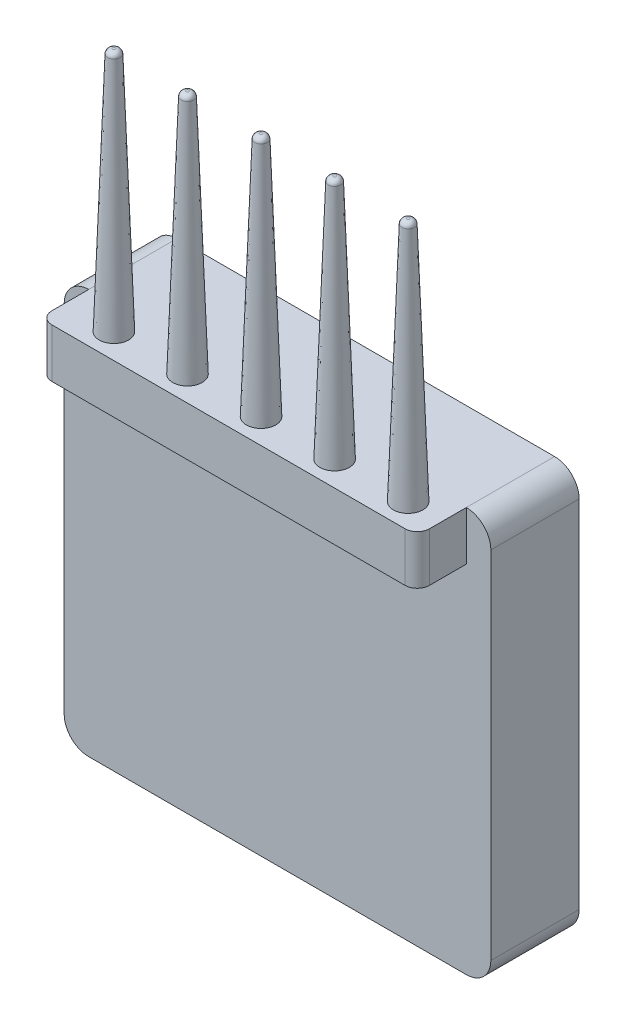
ISO-10303-21;
HEADER;
FILE_DESCRIPTION(('STEP AP214'),'2;1');
FILE_NAME('part.step','',(''),(''),'','','');
FILE_SCHEMA(('AUTOMOTIVE_DESIGN { 1 0 10303 214 1 1 1 1 }'));
ENDSEC;
DATA;
#1=APPLICATION_CONTEXT('core data for automotive mechanical design processes');
#2=APPLICATION_PROTOCOL_DEFINITION('international standard','automotive_design',2000,#1);
#3=PRODUCT_CONTEXT('',#1,'mechanical');
#4=PRODUCT('Part','Part','',(#3));
#5=PRODUCT_RELATED_PRODUCT_CATEGORY('part','',(#4));
#6=PRODUCT_DEFINITION_FORMATION('','',#4);
#7=PRODUCT_DEFINITION_CONTEXT('part definition',#1,'design');
#8=PRODUCT_DEFINITION('design','',#6,#7);
#9=PRODUCT_DEFINITION_SHAPE('','',#8);
#10=(LENGTH_UNIT() NAMED_UNIT(*) SI_UNIT(.MILLI.,.METRE.));
#11=(NAMED_UNIT(*) PLANE_ANGLE_UNIT() SI_UNIT($,.RADIAN.));
#12=(NAMED_UNIT(*) SI_UNIT($,.STERADIAN.) SOLID_ANGLE_UNIT());
#13=UNCERTAINTY_MEASURE_WITH_UNIT(LENGTH_MEASURE(1.E-05),#10,'distance_accuracy_value','');
#14=(GEOMETRIC_REPRESENTATION_CONTEXT(3) GLOBAL_UNCERTAINTY_ASSIGNED_CONTEXT((#13)) GLOBAL_UNIT_ASSIGNED_CONTEXT((#10,
#11,#12)) REPRESENTATION_CONTEXT('',''));
#15=CARTESIAN_POINT('',(0.,0.,0.));
#16=DIRECTION('',(0.,0.,1.));
#17=DIRECTION('',(1.,0.,0.));
#18=AXIS2_PLACEMENT_3D('',#15,#16,#17);
#19=CARTESIAN_POINT('',(-77.,-72.5,36.));
#20=DIRECTION('',(0.,0.,-1.));
#21=DIRECTION('',(-1.,0.,0.));
#22=AXIS2_PLACEMENT_3D('',#19,#20,#21);
#23=PLANE('',#22);
#24=DIRECTION('',(0.,-1.,0.));
#25=VECTOR('',#24,1.);
#26=CARTESIAN_POINT('',(-76.9999999999999,82.5,36.));
#27=LINE('',#26,#25);
#28=CARTESIAN_POINT('',(-76.9999999999999,82.5,36.));
#29=VERTEX_POINT('',#28);
#30=CARTESIAN_POINT('',(-76.9999999999999,62.5,36.));
#31=VERTEX_POINT('',#30);
#32=EDGE_CURVE('E154',#29,#31,#27,.T.);
#33=ORIENTED_EDGE('',*,*,#32,.F.);
#34=CARTESIAN_POINT('',(-77.,72.5,36.));
#35=DIRECTION('',(0.,0.,1.));
#36=DIRECTION('',(-1.,0.,0.));
#37=AXIS2_PLACEMENT_3D('',#34,#35,#36);
#38=CIRCLE('',#37,9.99999999999999);
#39=CARTESIAN_POINT('',(-87.,72.4999999999999,36.));
#40=VERTEX_POINT('',#39);
#41=EDGE_CURVE('E176',#29,#40,#38,.T.);
#42=ORIENTED_EDGE('',*,*,#41,.T.);
#43=DIRECTION('',(0.,-1.,0.));
#44=VECTOR('',#43,1.);
#45=CARTESIAN_POINT('',(-87.,-72.5,36.));
#46=LINE('',#45,#44);
#47=CARTESIAN_POINT('',(-87.,-72.5,36.));
#48=VERTEX_POINT('',#47);
#49=EDGE_CURVE('E178',#40,#48,#46,.T.);
#50=ORIENTED_EDGE('',*,*,#49,.T.);
#51=CARTESIAN_POINT('',(-77.,-72.5,36.));
#52=DIRECTION('',(0.,0.,1.));
#53=DIRECTION('',(-1.,0.,0.));
#54=AXIS2_PLACEMENT_3D('',#51,#52,#53);
#55=CIRCLE('',#54,9.99999999999999);
#56=CARTESIAN_POINT('',(-76.9999999999999,-82.5,36.));
#57=VERTEX_POINT('',#56);
#58=EDGE_CURVE('E165',#48,#57,#55,.T.);
#59=ORIENTED_EDGE('',*,*,#58,.T.);
#60=DIRECTION('',(1.,0.,0.));
#61=VECTOR('',#60,1.);
#62=CARTESIAN_POINT('',(-76.9999999999999,-82.5,36.));
#63=LINE('',#62,#61);
#64=CARTESIAN_POINT('',(76.9999999999999,-82.5,36.));
#65=VERTEX_POINT('',#64);
#66=EDGE_CURVE('E168',#57,#65,#63,.T.);
#67=ORIENTED_EDGE('',*,*,#66,.T.);
#68=CARTESIAN_POINT('',(77.,-72.5,36.));
#69=DIRECTION('',(0.,0.,1.));
#70=DIRECTION('',(1.,0.,0.));
#71=AXIS2_PLACEMENT_3D('',#68,#69,#70);
#72=CIRCLE('',#71,9.99999999999999);
#73=CARTESIAN_POINT('',(87.,-72.5,36.));
#74=VERTEX_POINT('',#73);
#75=EDGE_CURVE('E171',#65,#74,#72,.T.);
#76=ORIENTED_EDGE('',*,*,#75,.T.);
#77=DIRECTION('',(0.,1.,0.));
#78=VECTOR('',#77,1.);
#79=CARTESIAN_POINT('',(87.,-72.5,36.));
#80=LINE('',#79,#78);
#81=CARTESIAN_POINT('',(87.,72.4999999999999,36.));
#82=VERTEX_POINT('',#81);
#83=EDGE_CURVE('E173',#74,#82,#80,.T.);
#84=ORIENTED_EDGE('',*,*,#83,.T.);
#85=CARTESIAN_POINT('',(77.,72.5,36.));
#86=DIRECTION('',(0.,0.,1.));
#87=DIRECTION('',(-1.,0.,0.));
#88=AXIS2_PLACEMENT_3D('',#85,#86,#87);
#89=CIRCLE('',#88,9.99999999999999);
#90=CARTESIAN_POINT('',(76.9999999999999,82.5,36.));
#91=VERTEX_POINT('',#90);
#92=EDGE_CURVE('E148',#82,#91,#89,.T.);
#93=ORIENTED_EDGE('',*,*,#92,.T.);
#94=DIRECTION('',(0.,1.,0.));
#95=VECTOR('',#94,1.);
#96=CARTESIAN_POINT('',(76.9999999999999,82.5,36.));
#97=LINE('',#96,#95);
#98=CARTESIAN_POINT('',(76.9999999999999,62.5,36.));
#99=VERTEX_POINT('',#98);
#100=EDGE_CURVE('E133',#99,#91,#97,.T.);
#101=ORIENTED_EDGE('',*,*,#100,.F.);
#102=DIRECTION('',(1.,0.,0.));
#103=VECTOR('',#102,1.);
#104=CARTESIAN_POINT('',(-76.9999999999999,62.5,36.));
#105=LINE('',#104,#103);
#106=EDGE_CURVE('E145',#31,#99,#105,.T.);
#107=ORIENTED_EDGE('',*,*,#106,.F.);
#108=EDGE_LOOP('',(#33,#42,#50,#59,#67,#76,#84,#93,#101,#107));
#109=FACE_BOUND('',#108,.T.);
#110=ADVANCED_FACE('F35',(#109),#23,.F.);
#111=CARTESIAN_POINT('',(-77.,-72.5,36.));
#112=DIRECTION('',(0.,0.,-1.));
#113=DIRECTION('',(-1.,0.,0.));
#114=AXIS2_PLACEMENT_3D('',#111,#112,#113);
#115=CYLINDRICAL_SURFACE('',#114,9.99999999999999);
#116=CARTESIAN_POINT('',(-77.,-72.5,0.));
#117=DIRECTION('',(0.,0.,1.));
#118=DIRECTION('',(-1.,0.,0.));
#119=AXIS2_PLACEMENT_3D('',#116,#117,#118);
#120=CIRCLE('',#119,9.99999999999999);
#121=CARTESIAN_POINT('',(-87.,-72.5,0.));
#122=VERTEX_POINT('',#121);
#123=CARTESIAN_POINT('',(-76.9999999999999,-82.5,0.));
#124=VERTEX_POINT('',#123);
#125=EDGE_CURVE('E164',#122,#124,#120,.T.);
#126=ORIENTED_EDGE('',*,*,#125,.T.);
#127=DIRECTION('',(0.,0.,-1.));
#128=VECTOR('',#127,1.);
#129=CARTESIAN_POINT('',(-76.9999999999999,-82.5,36.));
#130=LINE('',#129,#128);
#131=EDGE_CURVE('E216',#57,#124,#130,.T.);
#132=ORIENTED_EDGE('',*,*,#131,.F.);
#133=ORIENTED_EDGE('',*,*,#58,.F.);
#134=DIRECTION('',(0.,0.,-1.));
#135=VECTOR('',#134,1.);
#136=CARTESIAN_POINT('',(-87.,-72.5,36.));
#137=LINE('',#136,#135);
#138=EDGE_CURVE('E180',#48,#122,#137,.T.);
#139=ORIENTED_EDGE('',*,*,#138,.T.);
#140=EDGE_LOOP('',(#126,#132,#133,#139));
#141=FACE_BOUND('',#140,.T.);
#142=ADVANCED_FACE('F302',(#141),#115,.T.);
#143=CARTESIAN_POINT('',(-76.9999999999999,-82.5,36.));
#144=DIRECTION('',(0.,1.,0.));
#145=DIRECTION('',(0.,0.,1.));
#146=AXIS2_PLACEMENT_3D('',#143,#144,#145);
#147=PLANE('',#146);
#148=DIRECTION('',(1.,0.,0.));
#149=VECTOR('',#148,1.);
#150=CARTESIAN_POINT('',(-76.9999999999999,-82.5,0.));
#151=LINE('',#150,#149);
#152=CARTESIAN_POINT('',(76.9999999999999,-82.5,0.));
#153=VERTEX_POINT('',#152);
#154=EDGE_CURVE('E183',#124,#153,#151,.T.);
#155=ORIENTED_EDGE('',*,*,#154,.T.);
#156=DIRECTION('',(0.,0.,-1.));
#157=VECTOR('',#156,1.);
#158=CARTESIAN_POINT('',(76.9999999999999,-82.5,36.));
#159=LINE('',#158,#157);
#160=EDGE_CURVE('E213',#65,#153,#159,.T.);
#161=ORIENTED_EDGE('',*,*,#160,.F.);
#162=ORIENTED_EDGE('',*,*,#66,.F.);
#163=ORIENTED_EDGE('',*,*,#131,.T.);
#164=EDGE_LOOP('',(#155,#161,#162,#163));
#165=FACE_BOUND('',#164,.T.);
#166=ADVANCED_FACE('F305',(#165),#147,.F.);
#167=CARTESIAN_POINT('',(77.,-72.5,36.));
#168=DIRECTION('',(0.,0.,-1.));
#169=DIRECTION('',(-1.,0.,0.));
#170=AXIS2_PLACEMENT_3D('',#167,#168,#169);
#171=CYLINDRICAL_SURFACE('',#170,9.99999999999999);
#172=CARTESIAN_POINT('',(77.,-72.5,0.));
#173=DIRECTION('',(0.,0.,1.));
#174=DIRECTION('',(1.,0.,0.));
#175=AXIS2_PLACEMENT_3D('',#172,#173,#174);
#176=CIRCLE('',#175,9.99999999999999);
#177=CARTESIAN_POINT('',(87.,-72.5,0.));
#178=VERTEX_POINT('',#177);
#179=EDGE_CURVE('E185',#153,#178,#176,.T.);
#180=ORIENTED_EDGE('',*,*,#179,.T.);
#181=DIRECTION('',(0.,0.,-1.));
#182=VECTOR('',#181,1.);
#183=CARTESIAN_POINT('',(87.,-72.5,36.));
#184=LINE('',#183,#182);
#185=EDGE_CURVE('E210',#74,#178,#184,.T.);
#186=ORIENTED_EDGE('',*,*,#185,.F.);
#187=ORIENTED_EDGE('',*,*,#75,.F.);
#188=ORIENTED_EDGE('',*,*,#160,.T.);
#189=EDGE_LOOP('',(#180,#186,#187,#188));
#190=FACE_BOUND('',#189,.T.);
#191=ADVANCED_FACE('F310',(#190),#171,.T.);
#192=CARTESIAN_POINT('',(87.,-72.5,36.));
#193=DIRECTION('',(-1.,0.,0.));
#194=DIRECTION('',(0.,0.,1.));
#195=AXIS2_PLACEMENT_3D('',#192,#193,#194);
#196=PLANE('',#195);
#197=DIRECTION('',(0.,1.,0.));
#198=VECTOR('',#197,1.);
#199=CARTESIAN_POINT('',(87.,-72.5,0.));
#200=LINE('',#199,#198);
#201=CARTESIAN_POINT('',(87.,72.4999999999999,0.));
#202=VERTEX_POINT('',#201);
#203=EDGE_CURVE('E187',#178,#202,#200,.T.);
#204=ORIENTED_EDGE('',*,*,#203,.T.);
#205=DIRECTION('',(0.,0.,-1.));
#206=VECTOR('',#205,1.);
#207=CARTESIAN_POINT('',(87.,72.4999999999999,36.));
#208=LINE('',#207,#206);
#209=EDGE_CURVE('E207',#82,#202,#208,.T.);
#210=ORIENTED_EDGE('',*,*,#209,.F.);
#211=ORIENTED_EDGE('',*,*,#83,.F.);
#212=ORIENTED_EDGE('',*,*,#185,.T.);
#213=EDGE_LOOP('',(#204,#210,#211,#212));
#214=FACE_BOUND('',#213,.T.);
#215=ADVANCED_FACE('F314',(#214),#196,.F.);
#216=CARTESIAN_POINT('',(77.,72.5,36.));
#217=DIRECTION('',(0.,0.,-1.));
#218=DIRECTION('',(-1.,0.,0.));
#219=AXIS2_PLACEMENT_3D('',#216,#217,#218);
#220=CYLINDRICAL_SURFACE('',#219,9.99999999999999);
#221=CARTESIAN_POINT('',(77.,72.5,0.));
#222=DIRECTION('',(0.,0.,1.));
#223=DIRECTION('',(-1.,0.,0.));
#224=AXIS2_PLACEMENT_3D('',#221,#222,#223);
#225=CIRCLE('',#224,9.99999999999999);
#226=CARTESIAN_POINT('',(76.9999999999999,82.5,0.));
#227=VERTEX_POINT('',#226);
#228=EDGE_CURVE('E189',#202,#227,#225,.T.);
#229=ORIENTED_EDGE('',*,*,#228,.T.);
#230=DIRECTION('',(0.,0.,-1.));
#231=VECTOR('',#230,1.);
#232=CARTESIAN_POINT('',(76.9999999999999,82.5,36.));
#233=LINE('',#232,#231);
#234=EDGE_CURVE('E204',#91,#227,#233,.T.);
#235=ORIENTED_EDGE('',*,*,#234,.F.);
#236=ORIENTED_EDGE('',*,*,#92,.F.);
#237=ORIENTED_EDGE('',*,*,#209,.T.);
#238=EDGE_LOOP('',(#229,#235,#236,#237));
#239=FACE_BOUND('',#238,.T.);
#240=ADVANCED_FACE('F318',(#239),#220,.T.);
#241=CARTESIAN_POINT('',(-76.9999999999999,82.5,36.));
#242=DIRECTION('',(0.,-1.,0.));
#243=DIRECTION('',(0.,0.,-1.));
#244=AXIS2_PLACEMENT_3D('',#241,#242,#243);
#245=PLANE('',#244);
#246=CARTESIAN_POINT('',(63.0000000000001,82.5,45.7165139862272));
#247=DIRECTION('',(0.,-1.,0.));
#248=DIRECTION('',(0.,0.,-1.));
#249=AXIS2_PLACEMENT_3D('',#246,#247,#248);
#250=CIRCLE('',#249,6.);
#251=CARTESIAN_POINT('',(63.0000000000001,82.5,39.7165139862272));
#252=VERTEX_POINT('',#251);
#253=EDGE_CURVE('E231',#252,#252,#250,.F.);
#254=ORIENTED_EDGE('',*,*,#253,.F.);
#255=EDGE_LOOP('',(#254));
#256=FACE_BOUND('',#255,.T.);
#257=CARTESIAN_POINT('',(33.0000000000001,82.5,45.7165139862272));
#258=DIRECTION('',(0.,-1.,0.));
#259=DIRECTION('',(0.,0.,-1.));
#260=AXIS2_PLACEMENT_3D('',#257,#258,#259);
#261=CIRCLE('',#260,6.00000000000001);
#262=CARTESIAN_POINT('',(33.0000000000001,82.5,39.7165139862272));
#263=VERTEX_POINT('',#262);
#264=EDGE_CURVE('E228',#263,#263,#261,.F.);
#265=ORIENTED_EDGE('',*,*,#264,.F.);
#266=EDGE_LOOP('',(#265));
#267=FACE_BOUND('',#266,.T.);
#268=CARTESIAN_POINT('',(3.00000000000007,82.5,45.7165139862272));
#269=DIRECTION('',(0.,-1.,0.));
#270=DIRECTION('',(0.,0.,-1.));
#271=AXIS2_PLACEMENT_3D('',#268,#269,#270);
#272=CIRCLE('',#271,6.);
#273=CARTESIAN_POINT('',(3.00000000000007,82.5,39.7165139862272));
#274=VERTEX_POINT('',#273);
#275=EDGE_CURVE('E225',#274,#274,#272,.F.);
#276=ORIENTED_EDGE('',*,*,#275,.F.);
#277=EDGE_LOOP('',(#276));
#278=FACE_BOUND('',#277,.T.);
#279=CARTESIAN_POINT('',(-26.9999999999999,82.5,45.7165139862272));
#280=DIRECTION('',(0.,-1.,0.));
#281=DIRECTION('',(0.,0.,-1.));
#282=AXIS2_PLACEMENT_3D('',#279,#280,#281);
#283=CIRCLE('',#282,6.);
#284=CARTESIAN_POINT('',(-26.9999999999999,82.5,39.7165139862272));
#285=VERTEX_POINT('',#284);
#286=EDGE_CURVE('E222',#285,#285,#283,.F.);
#287=ORIENTED_EDGE('',*,*,#286,.F.);
#288=EDGE_LOOP('',(#287));
#289=FACE_BOUND('',#288,.T.);
#290=CARTESIAN_POINT('',(-56.9999999999999,82.5,45.7165139862272));
#291=DIRECTION('',(0.,-1.,0.));
#292=DIRECTION('',(0.,0.,-1.));
#293=AXIS2_PLACEMENT_3D('',#290,#291,#292);
#294=CIRCLE('',#293,6.00000000000001);
#295=CARTESIAN_POINT('',(-56.9999999999999,82.5,39.7165139862272));
#296=VERTEX_POINT('',#295);
#297=EDGE_CURVE('E219',#296,#296,#294,.F.);
#298=ORIENTED_EDGE('',*,*,#297,.F.);
#299=EDGE_LOOP('',(#298));
#300=FACE_BOUND('',#299,.T.);
#301=DIRECTION('',(0.,0.,-1.));
#302=VECTOR('',#301,1.);
#303=CARTESIAN_POINT('',(-76.9999999999999,82.5,56.));
#304=LINE('',#303,#302);
#305=CARTESIAN_POINT('',(-76.9999999999999,82.5,51.));
#306=VERTEX_POINT('',#305);
#307=EDGE_CURVE('E159',#306,#29,#304,.T.);
#308=ORIENTED_EDGE('',*,*,#307,.F.);
#309=CARTESIAN_POINT('',(-71.9999999999999,82.5,51.));
#310=DIRECTION('',(0.,-1.,0.));
#311=DIRECTION('',(0.,0.,-1.));
#312=AXIS2_PLACEMENT_3D('',#309,#310,#311);
#313=CIRCLE('',#312,5.);
#314=CARTESIAN_POINT('',(-71.9999999999999,82.5,56.));
#315=VERTEX_POINT('',#314);
#316=EDGE_CURVE('E43',#306,#315,#313,.F.);
#317=ORIENTED_EDGE('',*,*,#316,.T.);
#318=DIRECTION('',(-1.,0.,0.));
#319=VECTOR('',#318,1.);
#320=CARTESIAN_POINT('',(-76.9999999999999,82.5,56.));
#321=LINE('',#320,#319);
#322=CARTESIAN_POINT('',(71.9999999999999,82.5,56.));
#323=VERTEX_POINT('',#322);
#324=EDGE_CURVE('E161',#323,#315,#321,.T.);
#325=ORIENTED_EDGE('',*,*,#324,.F.);
#326=CARTESIAN_POINT('',(71.9999999999999,82.5,51.));
#327=DIRECTION('',(0.,-1.,0.));
#328=DIRECTION('',(0.,0.,-1.));
#329=AXIS2_PLACEMENT_3D('',#326,#327,#328);
#330=CIRCLE('',#329,5.);
#331=CARTESIAN_POINT('',(76.9999999999999,82.5,51.));
#332=VERTEX_POINT('',#331);
#333=EDGE_CURVE('E50',#323,#332,#330,.F.);
#334=ORIENTED_EDGE('',*,*,#333,.T.);
#335=DIRECTION('',(0.,0.,-1.));
#336=VECTOR('',#335,1.);
#337=CARTESIAN_POINT('',(76.9999999999999,82.5,56.));
#338=LINE('',#337,#336);
#339=EDGE_CURVE('E139',#332,#91,#338,.T.);
#340=ORIENTED_EDGE('',*,*,#339,.T.);
#341=ORIENTED_EDGE('',*,*,#234,.T.);
#342=DIRECTION('',(-1.,0.,0.));
#343=VECTOR('',#342,1.);
#344=CARTESIAN_POINT('',(-76.9999999999999,82.5,0.));
#345=LINE('',#344,#343);
#346=CARTESIAN_POINT('',(-76.9999999999999,82.5,0.));
#347=VERTEX_POINT('',#346);
#348=EDGE_CURVE('E191',#227,#347,#345,.T.);
#349=ORIENTED_EDGE('',*,*,#348,.T.);
#350=DIRECTION('',(0.,0.,-1.));
#351=VECTOR('',#350,1.);
#352=CARTESIAN_POINT('',(-76.9999999999999,82.5,36.));
#353=LINE('',#352,#351);
#354=EDGE_CURVE('E201',#29,#347,#353,.T.);
#355=ORIENTED_EDGE('',*,*,#354,.F.);
#356=EDGE_LOOP('',(#308,#317,#325,#334,#340,#341,#349,#355));
#357=FACE_BOUND('',#356,.T.);
#358=ADVANCED_FACE('F277',(#256,#267,#278,#289,#300,#357),#245,.F.);
#359=CARTESIAN_POINT('',(-77.,72.5,36.));
#360=DIRECTION('',(0.,0.,-1.));
#361=DIRECTION('',(-1.,0.,0.));
#362=AXIS2_PLACEMENT_3D('',#359,#360,#361);
#363=CYLINDRICAL_SURFACE('',#362,9.99999999999999);
#364=CARTESIAN_POINT('',(-77.,72.5,0.));
#365=DIRECTION('',(0.,0.,1.));
#366=DIRECTION('',(-1.,0.,0.));
#367=AXIS2_PLACEMENT_3D('',#364,#365,#366);
#368=CIRCLE('',#367,9.99999999999999);
#369=CARTESIAN_POINT('',(-87.,72.4999999999999,0.));
#370=VERTEX_POINT('',#369);
#371=EDGE_CURVE('E193',#347,#370,#368,.T.);
#372=ORIENTED_EDGE('',*,*,#371,.T.);
#373=DIRECTION('',(0.,0.,-1.));
#374=VECTOR('',#373,1.);
#375=CARTESIAN_POINT('',(-87.,72.4999999999999,36.));
#376=LINE('',#375,#374);
#377=EDGE_CURVE('E198',#40,#370,#376,.T.);
#378=ORIENTED_EDGE('',*,*,#377,.F.);
#379=ORIENTED_EDGE('',*,*,#41,.F.);
#380=ORIENTED_EDGE('',*,*,#354,.T.);
#381=EDGE_LOOP('',(#372,#378,#379,#380));
#382=FACE_BOUND('',#381,.T.);
#383=ADVANCED_FACE('F292',(#382),#363,.T.);
#384=CARTESIAN_POINT('',(-87.,-72.5,36.));
#385=DIRECTION('',(1.,0.,0.));
#386=DIRECTION('',(0.,0.,-1.));
#387=AXIS2_PLACEMENT_3D('',#384,#385,#386);
#388=PLANE('',#387);
#389=DIRECTION('',(0.,-1.,0.));
#390=VECTOR('',#389,1.);
#391=CARTESIAN_POINT('',(-87.,-72.5,0.));
#392=LINE('',#391,#390);
#393=EDGE_CURVE('E169',#370,#122,#392,.T.);
#394=ORIENTED_EDGE('',*,*,#393,.T.);
#395=ORIENTED_EDGE('',*,*,#138,.F.);
#396=ORIENTED_EDGE('',*,*,#49,.F.);
#397=ORIENTED_EDGE('',*,*,#377,.T.);
#398=EDGE_LOOP('',(#394,#395,#396,#397));
#399=FACE_BOUND('',#398,.T.);
#400=ADVANCED_FACE('F297',(#399),#388,.F.);
#401=CARTESIAN_POINT('',(-77.,-72.5,0.));
#402=DIRECTION('',(0.,0.,-1.));
#403=DIRECTION('',(-1.,0.,0.));
#404=AXIS2_PLACEMENT_3D('',#401,#402,#403);
#405=PLANE('',#404);
#406=ORIENTED_EDGE('',*,*,#125,.F.);
#407=ORIENTED_EDGE('',*,*,#393,.F.);
#408=ORIENTED_EDGE('',*,*,#371,.F.);
#409=ORIENTED_EDGE('',*,*,#348,.F.);
#410=ORIENTED_EDGE('',*,*,#228,.F.);
#411=ORIENTED_EDGE('',*,*,#203,.F.);
#412=ORIENTED_EDGE('',*,*,#179,.F.);
#413=ORIENTED_EDGE('',*,*,#154,.F.);
#414=EDGE_LOOP('',(#406,#407,#408,#409,#410,#411,#412,#413));
#415=FACE_BOUND('',#414,.T.);
#416=ADVANCED_FACE('F320',(#415),#405,.T.);
#417=CARTESIAN_POINT('',(-76.9999999999999,82.5,56.));
#418=DIRECTION('',(1.,0.,0.));
#419=DIRECTION('',(0.,0.,-1.));
#420=AXIS2_PLACEMENT_3D('',#417,#418,#419);
#421=PLANE('',#420);
#422=DIRECTION('',(0.,0.,-1.));
#423=VECTOR('',#422,1.);
#424=CARTESIAN_POINT('',(-76.9999999999999,62.5,56.));
#425=LINE('',#424,#423);
#426=CARTESIAN_POINT('',(-76.9999999999999,62.5,51.));
#427=VERTEX_POINT('',#426);
#428=EDGE_CURVE('E138',#427,#31,#425,.T.);
#429=ORIENTED_EDGE('',*,*,#428,.F.);
#430=DIRECTION('',(0.,-1.,0.));
#431=VECTOR('',#430,1.);
#432=CARTESIAN_POINT('',(-76.9999999999999,82.5,51.));
#433=LINE('',#432,#431);
#434=EDGE_CURVE('E58',#427,#306,#433,.F.);
#435=ORIENTED_EDGE('',*,*,#434,.T.);
#436=ORIENTED_EDGE('',*,*,#307,.T.);
#437=ORIENTED_EDGE('',*,*,#32,.T.);
#438=EDGE_LOOP('',(#429,#435,#436,#437));
#439=FACE_BOUND('',#438,.T.);
#440=ADVANCED_FACE('F286',(#439),#421,.F.);
#441=CARTESIAN_POINT('',(-76.9999999999999,62.5,56.));
#442=DIRECTION('',(0.,1.,0.));
#443=DIRECTION('',(0.,0.,1.));
#444=AXIS2_PLACEMENT_3D('',#441,#442,#443);
#445=PLANE('',#444);
#446=DIRECTION('',(1.,0.,0.));
#447=VECTOR('',#446,1.);
#448=CARTESIAN_POINT('',(-76.9999999999999,62.5,56.));
#449=LINE('',#448,#447);
#450=CARTESIAN_POINT('',(-71.9999999999999,62.5,56.));
#451=VERTEX_POINT('',#450);
#452=CARTESIAN_POINT('',(71.9999999999999,62.5,56.));
#453=VERTEX_POINT('',#452);
#454=EDGE_CURVE('E150',#451,#453,#449,.T.);
#455=ORIENTED_EDGE('',*,*,#454,.F.);
#456=CARTESIAN_POINT('',(-71.9999999999999,62.5,51.));
#457=DIRECTION('',(0.,1.,0.));
#458=DIRECTION('',(0.,0.,1.));
#459=AXIS2_PLACEMENT_3D('',#456,#457,#458);
#460=CIRCLE('',#459,5.);
#461=EDGE_CURVE('E272',#451,#427,#460,.F.);
#462=ORIENTED_EDGE('',*,*,#461,.T.);
#463=ORIENTED_EDGE('',*,*,#428,.T.);
#464=ORIENTED_EDGE('',*,*,#106,.T.);
#465=DIRECTION('',(0.,0.,-1.));
#466=VECTOR('',#465,1.);
#467=CARTESIAN_POINT('',(76.9999999999999,62.5,56.));
#468=LINE('',#467,#466);
#469=CARTESIAN_POINT('',(76.9999999999999,62.5,51.));
#470=VERTEX_POINT('',#469);
#471=EDGE_CURVE('E130',#470,#99,#468,.T.);
#472=ORIENTED_EDGE('',*,*,#471,.F.);
#473=CARTESIAN_POINT('',(71.9999999999999,62.5,51.));
#474=DIRECTION('',(0.,1.,0.));
#475=DIRECTION('',(0.,0.,1.));
#476=AXIS2_PLACEMENT_3D('',#473,#474,#475);
#477=CIRCLE('',#476,5.);
#478=EDGE_CURVE('E270',#470,#453,#477,.F.);
#479=ORIENTED_EDGE('',*,*,#478,.T.);
#480=EDGE_LOOP('',(#455,#462,#463,#464,#472,#479));
#481=FACE_BOUND('',#480,.T.);
#482=ADVANCED_FACE('F153',(#481),#445,.F.);
#483=CARTESIAN_POINT('',(76.9999999999999,82.5,56.));
#484=DIRECTION('',(-1.,0.,0.));
#485=DIRECTION('',(0.,0.,1.));
#486=AXIS2_PLACEMENT_3D('',#483,#484,#485);
#487=PLANE('',#486);
#488=ORIENTED_EDGE('',*,*,#339,.F.);
#489=DIRECTION('',(0.,1.,0.));
#490=VECTOR('',#489,1.);
#491=CARTESIAN_POINT('',(76.9999999999999,62.5,51.));
#492=LINE('',#491,#490);
#493=EDGE_CURVE('E11',#332,#470,#492,.F.);
#494=ORIENTED_EDGE('',*,*,#493,.T.);
#495=ORIENTED_EDGE('',*,*,#471,.T.);
#496=ORIENTED_EDGE('',*,*,#100,.T.);
#497=EDGE_LOOP('',(#488,#494,#495,#496));
#498=FACE_BOUND('',#497,.T.);
#499=ADVANCED_FACE('F132',(#498),#487,.F.);
#500=CARTESIAN_POINT('',(0.,0.,56.));
#501=DIRECTION('',(0.,0.,1.));
#502=DIRECTION('',(1.,0.,0.));
#503=AXIS2_PLACEMENT_3D('',#500,#501,#502);
#504=PLANE('',#503);
#505=ORIENTED_EDGE('',*,*,#324,.T.);
#506=DIRECTION('',(0.,-1.,0.));
#507=VECTOR('',#506,1.);
#508=CARTESIAN_POINT('',(-71.9999999999999,62.5,56.));
#509=LINE('',#508,#507);
#510=EDGE_CURVE('E267',#315,#451,#509,.T.);
#511=ORIENTED_EDGE('',*,*,#510,.T.);
#512=ORIENTED_EDGE('',*,*,#454,.T.);
#513=DIRECTION('',(0.,1.,0.));
#514=VECTOR('',#513,1.);
#515=CARTESIAN_POINT('',(71.9999999999999,82.5,56.));
#516=LINE('',#515,#514);
#517=EDGE_CURVE('E264',#453,#323,#516,.T.);
#518=ORIENTED_EDGE('',*,*,#517,.T.);
#519=EDGE_LOOP('',(#505,#511,#512,#518));
#520=FACE_BOUND('',#519,.T.);
#521=ADVANCED_FACE('F282',(#520),#504,.T.);
#522=CARTESIAN_POINT('',(-56.9999999999999,82.5,45.7165139862272));
#523=DIRECTION('',(0.,-1.,0.));
#524=DIRECTION('',(0.,0.,1.));
#525=AXIS2_PLACEMENT_3D('',#522,#523,#524);
#526=CONICAL_SURFACE('',#525,6.00000000000001,0.0349065850398866);
#527=CARTESIAN_POINT('',(-56.9999999999999,180.569798993405,45.7165139862272));
#528=DIRECTION('',(0.,-1.,0.));
#529=DIRECTION('',(0.,0.,-1.));
#530=AXIS2_PLACEMENT_3D('',#527,#528,#529);
#531=CIRCLE('',#530,2.57532715524928);
#532=CARTESIAN_POINT('',(-56.9999999999999,180.569798993405,43.1411868309779));
#533=VERTEX_POINT('',#532);
#534=EDGE_CURVE('E261',#533,#533,#531,.T.);
#535=ORIENTED_EDGE('',*,*,#534,.T.);
#536=EDGE_LOOP('',(#535));
#537=FACE_BOUND('',#536,.T.);
#538=ORIENTED_EDGE('',*,*,#297,.T.);
#539=EDGE_LOOP('',(#538));
#540=FACE_BOUND('',#539,.T.);
#541=ADVANCED_FACE('F343',(#537,#540),#526,.T.);
#542=CARTESIAN_POINT('',(-56.9999999999999,182.5,45.7165139862272));
#543=DIRECTION('',(0.,1.,0.));
#544=DIRECTION('',(0.,0.,1.));
#545=AXIS2_PLACEMENT_3D('',#542,#543,#544);
#546=PLANE('',#545);
#547=CARTESIAN_POINT('',(-56.9999999999999,182.5,45.7165139862272));
#548=DIRECTION('',(0.,1.,0.));
#549=DIRECTION('',(0.,0.,1.));
#550=AXIS2_PLACEMENT_3D('',#547,#548,#549);
#551=CIRCLE('',#550,0.576545501211085);
#552=CARTESIAN_POINT('',(-56.9999999999999,182.5,46.2930594874383));
#553=VERTEX_POINT('',#552);
#554=EDGE_CURVE('E258',#553,#553,#551,.T.);
#555=ORIENTED_EDGE('',*,*,#554,.T.);
#556=EDGE_LOOP('',(#555));
#557=FACE_BOUND('',#556,.T.);
#558=ADVANCED_FACE('F346',(#557),#546,.T.);
#559=CARTESIAN_POINT('',(-26.9999999999999,82.5,45.7165139862272));
#560=DIRECTION('',(0.,-1.,0.));
#561=DIRECTION('',(0.,0.,1.));
#562=AXIS2_PLACEMENT_3D('',#559,#560,#561);
#563=CONICAL_SURFACE('',#562,6.,0.0349065850398866);
#564=CARTESIAN_POINT('',(-26.9999999999999,180.569798993405,45.7165139862272));
#565=DIRECTION('',(0.,-1.,0.));
#566=DIRECTION('',(0.,0.,-1.));
#567=AXIS2_PLACEMENT_3D('',#564,#565,#566);
#568=CIRCLE('',#567,2.57532715524927);
#569=CARTESIAN_POINT('',(-26.9999999999999,180.569798993405,43.1411868309779));
#570=VERTEX_POINT('',#569);
#571=EDGE_CURVE('E255',#570,#570,#568,.T.);
#572=ORIENTED_EDGE('',*,*,#571,.T.);
#573=EDGE_LOOP('',(#572));
#574=FACE_BOUND('',#573,.T.);
#575=ORIENTED_EDGE('',*,*,#286,.T.);
#576=EDGE_LOOP('',(#575));
#577=FACE_BOUND('',#576,.T.);
#578=ADVANCED_FACE('F350',(#574,#577),#563,.T.);
#579=CARTESIAN_POINT('',(-26.9999999999999,182.5,45.7165139862272));
#580=DIRECTION('',(0.,1.,0.));
#581=DIRECTION('',(0.,0.,1.));
#582=AXIS2_PLACEMENT_3D('',#579,#580,#581);
#583=PLANE('',#582);
#584=CARTESIAN_POINT('',(-26.9999999999999,182.5,45.7165139862272));
#585=DIRECTION('',(0.,1.,0.));
#586=DIRECTION('',(0.,0.,1.));
#587=AXIS2_PLACEMENT_3D('',#584,#585,#586);
#588=CIRCLE('',#587,0.576545501211073);
#589=CARTESIAN_POINT('',(-26.9999999999999,182.5,46.2930594874383));
#590=VERTEX_POINT('',#589);
#591=EDGE_CURVE('E252',#590,#590,#588,.T.);
#592=ORIENTED_EDGE('',*,*,#591,.T.);
#593=EDGE_LOOP('',(#592));
#594=FACE_BOUND('',#593,.T.);
#595=ADVANCED_FACE('F354',(#594),#583,.T.);
#596=CARTESIAN_POINT('',(3.00000000000007,82.5,45.7165139862272));
#597=DIRECTION('',(0.,-1.,0.));
#598=DIRECTION('',(0.,0.,1.));
#599=AXIS2_PLACEMENT_3D('',#596,#597,#598);
#600=CONICAL_SURFACE('',#599,6.,0.0349065850398866);
#601=CARTESIAN_POINT('',(3.00000000000007,180.569798993405,45.7165139862272));
#602=DIRECTION('',(0.,-1.,0.));
#603=DIRECTION('',(0.,0.,-1.));
#604=AXIS2_PLACEMENT_3D('',#601,#602,#603);
#605=CIRCLE('',#604,2.57532715524927);
#606=CARTESIAN_POINT('',(3.00000000000007,180.569798993405,43.1411868309779));
#607=VERTEX_POINT('',#606);
#608=EDGE_CURVE('E249',#607,#607,#605,.T.);
#609=ORIENTED_EDGE('',*,*,#608,.T.);
#610=EDGE_LOOP('',(#609));
#611=FACE_BOUND('',#610,.T.);
#612=ORIENTED_EDGE('',*,*,#275,.T.);
#613=EDGE_LOOP('',(#612));
#614=FACE_BOUND('',#613,.T.);
#615=ADVANCED_FACE('F358',(#611,#614),#600,.T.);
#616=CARTESIAN_POINT('',(3.00000000000007,182.5,45.7165139862272));
#617=DIRECTION('',(0.,1.,0.));
#618=DIRECTION('',(0.,0.,1.));
#619=AXIS2_PLACEMENT_3D('',#616,#617,#618);
#620=PLANE('',#619);
#621=CARTESIAN_POINT('',(3.00000000000007,182.5,45.7165139862272));
#622=DIRECTION('',(0.,1.,0.));
#623=DIRECTION('',(0.,0.,1.));
#624=AXIS2_PLACEMENT_3D('',#621,#622,#623);
#625=CIRCLE('',#624,0.576545501211073);
#626=CARTESIAN_POINT('',(3.00000000000007,182.5,46.2930594874383));
#627=VERTEX_POINT('',#626);
#628=EDGE_CURVE('E246',#627,#627,#625,.T.);
#629=ORIENTED_EDGE('',*,*,#628,.T.);
#630=EDGE_LOOP('',(#629));
#631=FACE_BOUND('',#630,.T.);
#632=ADVANCED_FACE('F362',(#631),#620,.T.);
#633=CARTESIAN_POINT('',(33.0000000000001,82.5,45.7165139862272));
#634=DIRECTION('',(0.,-1.,0.));
#635=DIRECTION('',(0.,0.,1.));
#636=AXIS2_PLACEMENT_3D('',#633,#634,#635);
#637=CONICAL_SURFACE('',#636,6.00000000000001,0.0349065850398866);
#638=CARTESIAN_POINT('',(33.0000000000001,180.569798993405,45.7165139862272));
#639=DIRECTION('',(0.,-1.,0.));
#640=DIRECTION('',(0.,0.,-1.));
#641=AXIS2_PLACEMENT_3D('',#638,#639,#640);
#642=CIRCLE('',#641,2.57532715524928);
#643=CARTESIAN_POINT('',(33.0000000000001,180.569798993405,43.1411868309779));
#644=VERTEX_POINT('',#643);
#645=EDGE_CURVE('E243',#644,#644,#642,.T.);
#646=ORIENTED_EDGE('',*,*,#645,.T.);
#647=EDGE_LOOP('',(#646));
#648=FACE_BOUND('',#647,.T.);
#649=ORIENTED_EDGE('',*,*,#264,.T.);
#650=EDGE_LOOP('',(#649));
#651=FACE_BOUND('',#650,.T.);
#652=ADVANCED_FACE('F366',(#648,#651),#637,.T.);
#653=CARTESIAN_POINT('',(33.0000000000001,182.5,45.7165139862272));
#654=DIRECTION('',(0.,1.,0.));
#655=DIRECTION('',(0.,0.,1.));
#656=AXIS2_PLACEMENT_3D('',#653,#654,#655);
#657=PLANE('',#656);
#658=CARTESIAN_POINT('',(33.0000000000001,182.5,45.7165139862272));
#659=DIRECTION('',(0.,1.,0.));
#660=DIRECTION('',(0.,0.,1.));
#661=AXIS2_PLACEMENT_3D('',#658,#659,#660);
#662=CIRCLE('',#661,0.576545501211085);
#663=CARTESIAN_POINT('',(33.0000000000001,182.5,46.2930594874383));
#664=VERTEX_POINT('',#663);
#665=EDGE_CURVE('E240',#664,#664,#662,.T.);
#666=ORIENTED_EDGE('',*,*,#665,.T.);
#667=EDGE_LOOP('',(#666));
#668=FACE_BOUND('',#667,.T.);
#669=ADVANCED_FACE('F370',(#668),#657,.T.);
#670=CARTESIAN_POINT('',(63.0000000000001,82.5,45.7165139862272));
#671=DIRECTION('',(0.,-1.,0.));
#672=DIRECTION('',(0.,0.,1.));
#673=AXIS2_PLACEMENT_3D('',#670,#671,#672);
#674=CONICAL_SURFACE('',#673,6.,0.0349065850398866);
#675=CARTESIAN_POINT('',(63.0000000000001,180.569798993405,45.7165139862272));
#676=DIRECTION('',(0.,-1.,0.));
#677=DIRECTION('',(0.,0.,-1.));
#678=AXIS2_PLACEMENT_3D('',#675,#676,#677);
#679=CIRCLE('',#678,2.57532715524927);
#680=CARTESIAN_POINT('',(63.0000000000001,180.569798993405,43.1411868309779));
#681=VERTEX_POINT('',#680);
#682=EDGE_CURVE('E237',#681,#681,#679,.T.);
#683=ORIENTED_EDGE('',*,*,#682,.T.);
#684=EDGE_LOOP('',(#683));
#685=FACE_BOUND('',#684,.T.);
#686=ORIENTED_EDGE('',*,*,#253,.T.);
#687=EDGE_LOOP('',(#686));
#688=FACE_BOUND('',#687,.T.);
#689=ADVANCED_FACE('F374',(#685,#688),#674,.T.);
#690=CARTESIAN_POINT('',(63.0000000000001,182.5,45.7165139862272));
#691=DIRECTION('',(0.,1.,0.));
#692=DIRECTION('',(0.,0.,1.));
#693=AXIS2_PLACEMENT_3D('',#690,#691,#692);
#694=PLANE('',#693);
#695=CARTESIAN_POINT('',(63.0000000000001,182.5,45.7165139862272));
#696=DIRECTION('',(0.,1.,0.));
#697=DIRECTION('',(0.,0.,1.));
#698=AXIS2_PLACEMENT_3D('',#695,#696,#697);
#699=CIRCLE('',#698,0.576545501211079);
#700=CARTESIAN_POINT('',(63.0000000000001,182.5,46.2930594874383));
#701=VERTEX_POINT('',#700);
#702=EDGE_CURVE('E234',#701,#701,#699,.T.);
#703=ORIENTED_EDGE('',*,*,#702,.T.);
#704=EDGE_LOOP('',(#703));
#705=FACE_BOUND('',#704,.T.);
#706=ADVANCED_FACE('F378',(#705),#694,.T.);
#707=CARTESIAN_POINT('',(63.0000000000001,180.5,45.7165139862272));
#708=DIRECTION('',(0.,1.,0.));
#709=DIRECTION('',(0.,0.,1.));
#710=AXIS2_PLACEMENT_3D('',#707,#708,#709);
#711=DEGENERATE_TOROIDAL_SURFACE('',#710,0.576545501211079,2.,.T.);
#712=ORIENTED_EDGE('',*,*,#682,.F.);
#713=EDGE_LOOP('',(#712));
#714=FACE_BOUND('',#713,.T.);
#715=ORIENTED_EDGE('',*,*,#702,.F.);
#716=EDGE_LOOP('',(#715));
#717=FACE_BOUND('',#716,.T.);
#718=ADVANCED_FACE('F381',(#714,#717),#711,.T.);
#719=CARTESIAN_POINT('',(33.0000000000001,180.5,45.7165139862272));
#720=DIRECTION('',(0.,1.,0.));
#721=DIRECTION('',(0.,0.,1.));
#722=AXIS2_PLACEMENT_3D('',#719,#720,#721);
#723=DEGENERATE_TOROIDAL_SURFACE('',#722,0.576545501211085,2.,.T.);
#724=ORIENTED_EDGE('',*,*,#645,.F.);
#725=EDGE_LOOP('',(#724));
#726=FACE_BOUND('',#725,.T.);
#727=ORIENTED_EDGE('',*,*,#665,.F.);
#728=EDGE_LOOP('',(#727));
#729=FACE_BOUND('',#728,.T.);
#730=ADVANCED_FACE('F386',(#726,#729),#723,.T.);
#731=CARTESIAN_POINT('',(3.00000000000007,180.5,45.7165139862272));
#732=DIRECTION('',(0.,1.,0.));
#733=DIRECTION('',(0.,0.,1.));
#734=AXIS2_PLACEMENT_3D('',#731,#732,#733);
#735=DEGENERATE_TOROIDAL_SURFACE('',#734,0.576545501211073,2.,.T.);
#736=ORIENTED_EDGE('',*,*,#608,.F.);
#737=EDGE_LOOP('',(#736));
#738=FACE_BOUND('',#737,.T.);
#739=ORIENTED_EDGE('',*,*,#628,.F.);
#740=EDGE_LOOP('',(#739));
#741=FACE_BOUND('',#740,.T.);
#742=ADVANCED_FACE('F394',(#738,#741),#735,.T.);
#743=CARTESIAN_POINT('',(-26.9999999999999,180.5,45.7165139862272));
#744=DIRECTION('',(0.,1.,0.));
#745=DIRECTION('',(0.,0.,1.));
#746=AXIS2_PLACEMENT_3D('',#743,#744,#745);
#747=DEGENERATE_TOROIDAL_SURFACE('',#746,0.576545501211073,2.,.T.);
#748=ORIENTED_EDGE('',*,*,#571,.F.);
#749=EDGE_LOOP('',(#748));
#750=FACE_BOUND('',#749,.T.);
#751=ORIENTED_EDGE('',*,*,#591,.F.);
#752=EDGE_LOOP('',(#751));
#753=FACE_BOUND('',#752,.T.);
#754=ADVANCED_FACE('F402',(#750,#753),#747,.T.);
#755=CARTESIAN_POINT('',(-56.9999999999999,180.5,45.7165139862272));
#756=DIRECTION('',(0.,1.,0.));
#757=DIRECTION('',(0.,0.,1.));
#758=AXIS2_PLACEMENT_3D('',#755,#756,#757);
#759=DEGENERATE_TOROIDAL_SURFACE('',#758,0.576545501211085,2.,.T.);
#760=ORIENTED_EDGE('',*,*,#534,.F.);
#761=EDGE_LOOP('',(#760));
#762=FACE_BOUND('',#761,.T.);
#763=ORIENTED_EDGE('',*,*,#554,.F.);
#764=EDGE_LOOP('',(#763));
#765=FACE_BOUND('',#764,.T.);
#766=ADVANCED_FACE('F406',(#762,#765),#759,.T.);
#767=CARTESIAN_POINT('',(-71.9999999999999,0.,51.));
#768=DIRECTION('',(0.,1.,0.));
#769=DIRECTION('',(0.,0.,1.));
#770=AXIS2_PLACEMENT_3D('',#767,#768,#769);
#771=CYLINDRICAL_SURFACE('',#770,5.);
#772=ORIENTED_EDGE('',*,*,#316,.F.);
#773=ORIENTED_EDGE('',*,*,#434,.F.);
#774=ORIENTED_EDGE('',*,*,#461,.F.);
#775=ORIENTED_EDGE('',*,*,#510,.F.);
#776=EDGE_LOOP('',(#772,#773,#774,#775));
#777=FACE_BOUND('',#776,.T.);
#778=ADVANCED_FACE('F285',(#777),#771,.T.);
#779=CARTESIAN_POINT('',(71.9999999999999,0.,51.));
#780=DIRECTION('',(0.,-1.,0.));
#781=DIRECTION('',(0.,0.,-1.));
#782=AXIS2_PLACEMENT_3D('',#779,#780,#781);
#783=CYLINDRICAL_SURFACE('',#782,5.);
#784=ORIENTED_EDGE('',*,*,#478,.F.);
#785=ORIENTED_EDGE('',*,*,#493,.F.);
#786=ORIENTED_EDGE('',*,*,#333,.F.);
#787=ORIENTED_EDGE('',*,*,#517,.F.);
#788=EDGE_LOOP('',(#784,#785,#786,#787));
#789=FACE_BOUND('',#788,.T.);
#790=ADVANCED_FACE('F37',(#789),#783,.T.);
#791=CLOSED_SHELL('',(#110,#142,#166,#191,#215,#240,#358,#383,#400,#416,#440,#482,#499,#521,
#541,#558,#578,#595,#615,#632,#652,#669,#689,#706,#718,#730,#742,#754,#766,#778,#790));
#792=MANIFOLD_SOLID_BREP('B2',#791);
#793=ADVANCED_BREP_SHAPE_REPRESENTATION('',(#18,#792),#14);
#794=SHAPE_DEFINITION_REPRESENTATION(#9,#793);
ENDSEC;
END-ISO-10303-21;
